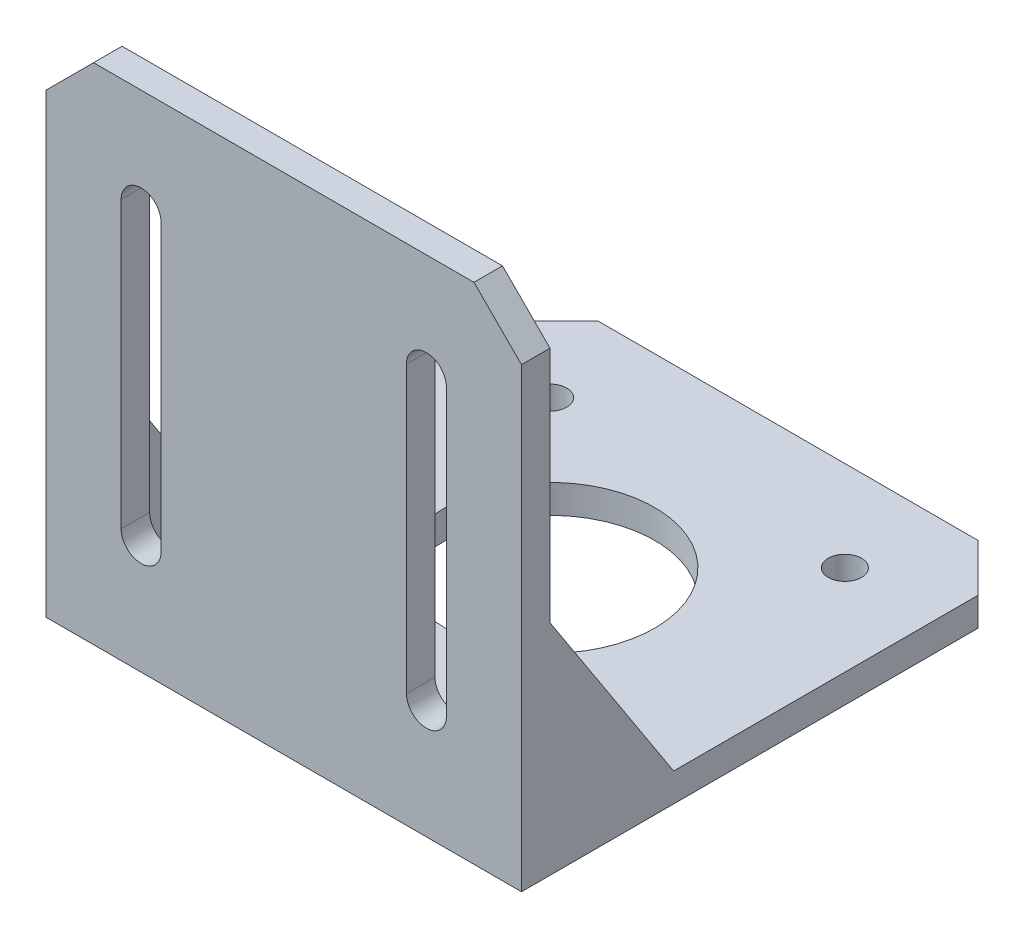
ISO-10303-21;
HEADER;
FILE_DESCRIPTION(('STEP AP214'),'2;1');
FILE_NAME('part.step','',(''),(''),'','','');
FILE_SCHEMA(('AUTOMOTIVE_DESIGN { 1 0 10303 214 1 1 1 1 }'));
ENDSEC;
DATA;
#1=APPLICATION_CONTEXT('core data for automotive mechanical design processes');
#2=APPLICATION_PROTOCOL_DEFINITION('international standard','automotive_design',2000,#1);
#3=PRODUCT_CONTEXT('',#1,'mechanical');
#4=PRODUCT('Part','Part','',(#3));
#5=PRODUCT_RELATED_PRODUCT_CATEGORY('part','',(#4));
#6=PRODUCT_DEFINITION_FORMATION('','',#4);
#7=PRODUCT_DEFINITION_CONTEXT('part definition',#1,'design');
#8=PRODUCT_DEFINITION('design','',#6,#7);
#9=PRODUCT_DEFINITION_SHAPE('','',#8);
#10=(LENGTH_UNIT() NAMED_UNIT(*) SI_UNIT(.MILLI.,.METRE.));
#11=(NAMED_UNIT(*) PLANE_ANGLE_UNIT() SI_UNIT($,.RADIAN.));
#12=(NAMED_UNIT(*) SI_UNIT($,.STERADIAN.) SOLID_ANGLE_UNIT());
#13=UNCERTAINTY_MEASURE_WITH_UNIT(LENGTH_MEASURE(1.E-05),#10,'distance_accuracy_value','');
#14=(GEOMETRIC_REPRESENTATION_CONTEXT(3) GLOBAL_UNCERTAINTY_ASSIGNED_CONTEXT((#13)) GLOBAL_UNIT_ASSIGNED_CONTEXT((#10,
#11,#12)) REPRESENTATION_CONTEXT('',''));
#15=CARTESIAN_POINT('',(0.,0.,0.));
#16=DIRECTION('',(0.,0.,1.));
#17=DIRECTION('',(1.,0.,0.));
#18=AXIS2_PLACEMENT_3D('',#15,#16,#17);
#19=CARTESIAN_POINT('',(0.,3.,0.));
#20=DIRECTION('',(0.,-1.,0.));
#21=DIRECTION('',(0.,0.,-1.));
#22=AXIS2_PLACEMENT_3D('',#19,#20,#21);
#23=PLANE('',#22);
#24=DIRECTION('',(0.,0.,-1.));
#25=VECTOR('',#24,1.);
#26=CARTESIAN_POINT('',(47.,3.,0.));
#27=LINE('',#26,#25);
#28=CARTESIAN_POINT('',(47.,3.,0.));
#29=VERTEX_POINT('',#28);
#30=CARTESIAN_POINT('',(47.,3.,-13.));
#31=VERTEX_POINT('',#30);
#32=EDGE_CURVE('E199',#29,#31,#27,.T.);
#33=ORIENTED_EDGE('',*,*,#32,.T.);
#34=DIRECTION('',(1.,0.,0.));
#35=VECTOR('',#34,1.);
#36=CARTESIAN_POINT('',(47.,3.,-13.));
#37=LINE('',#36,#35);
#38=CARTESIAN_POINT('',(50.,3.,-13.));
#39=VERTEX_POINT('',#38);
#40=EDGE_CURVE('E743',#31,#39,#37,.T.);
#41=ORIENTED_EDGE('',*,*,#40,.T.);
#42=DIRECTION('',(0.,0.,-1.));
#43=VECTOR('',#42,1.);
#44=CARTESIAN_POINT('',(50.,3.,0.));
#45=LINE('',#44,#43);
#46=CARTESIAN_POINT('',(50.,3.,-45.));
#47=VERTEX_POINT('',#46);
#48=EDGE_CURVE('E92',#39,#47,#45,.T.);
#49=ORIENTED_EDGE('',*,*,#48,.T.);
#50=DIRECTION('',(-0.707106781186547,0.,-0.707106781186547));
#51=VECTOR('',#50,1.);
#52=CARTESIAN_POINT('',(45.,3.,-50.));
#53=LINE('',#52,#51);
#54=CARTESIAN_POINT('',(45.,3.,-50.));
#55=VERTEX_POINT('',#54);
#56=EDGE_CURVE('E224',#47,#55,#53,.T.);
#57=ORIENTED_EDGE('',*,*,#56,.T.);
#58=DIRECTION('',(-1.,0.,0.));
#59=VECTOR('',#58,1.);
#60=CARTESIAN_POINT('',(5.,3.,-50.));
#61=LINE('',#60,#59);
#62=CARTESIAN_POINT('',(5.,3.,-50.));
#63=VERTEX_POINT('',#62);
#64=EDGE_CURVE('E230',#55,#63,#61,.T.);
#65=ORIENTED_EDGE('',*,*,#64,.T.);
#66=DIRECTION('',(-0.707106781186548,0.,0.707106781186547));
#67=VECTOR('',#66,1.);
#68=CARTESIAN_POINT('',(0.,3.,-45.));
#69=LINE('',#68,#67);
#70=CARTESIAN_POINT('',(0.,3.,-45.));
#71=VERTEX_POINT('',#70);
#72=EDGE_CURVE('E65',#63,#71,#69,.T.);
#73=ORIENTED_EDGE('',*,*,#72,.T.);
#74=DIRECTION('',(0.,0.,1.));
#75=VECTOR('',#74,1.);
#76=CARTESIAN_POINT('',(0.,3.,0.));
#77=LINE('',#76,#75);
#78=CARTESIAN_POINT('',(0.,3.,-13.));
#79=VERTEX_POINT('',#78);
#80=EDGE_CURVE('E222',#71,#79,#77,.T.);
#81=ORIENTED_EDGE('',*,*,#80,.T.);
#82=DIRECTION('',(-1.,0.,0.));
#83=VECTOR('',#82,1.);
#84=CARTESIAN_POINT('',(3.,3.,-13.));
#85=LINE('',#84,#83);
#86=CARTESIAN_POINT('',(3.,3.,-13.));
#87=VERTEX_POINT('',#86);
#88=EDGE_CURVE('E654',#87,#79,#85,.T.);
#89=ORIENTED_EDGE('',*,*,#88,.F.);
#90=DIRECTION('',(0.,0.,1.));
#91=VECTOR('',#90,1.);
#92=CARTESIAN_POINT('',(3.,3.,0.));
#93=LINE('',#92,#91);
#94=CARTESIAN_POINT('',(3.,3.,0.));
#95=VERTEX_POINT('',#94);
#96=EDGE_CURVE('E221',#87,#95,#93,.T.);
#97=ORIENTED_EDGE('',*,*,#96,.T.);
#98=DIRECTION('',(1.,0.,0.));
#99=VECTOR('',#98,1.);
#100=CARTESIAN_POINT('',(0.,3.,0.));
#101=LINE('',#100,#99);
#102=EDGE_CURVE('E213',#95,#29,#101,.T.);
#103=ORIENTED_EDGE('',*,*,#102,.T.);
#104=EDGE_LOOP('',(#33,#41,#49,#57,#65,#73,#81,#89,#97,#103));
#105=FACE_BOUND('',#104,.T.);
#106=CARTESIAN_POINT('',(25.,3.,-25.));
#107=DIRECTION('',(0.,1.,0.));
#108=DIRECTION('',(0.,0.,1.));
#109=AXIS2_PLACEMENT_3D('',#106,#107,#108);
#110=CIRCLE('',#109,11.);
#111=CARTESIAN_POINT('',(25.,3.,-14.));
#112=VERTEX_POINT('',#111);
#113=EDGE_CURVE('E237',#112,#112,#110,.T.);
#114=ORIENTED_EDGE('',*,*,#113,.F.);
#115=EDGE_LOOP('',(#114));
#116=FACE_BOUND('',#115,.T.);
#117=CARTESIAN_POINT('',(9.5,3.,-40.5));
#118=DIRECTION('',(0.,1.,0.));
#119=DIRECTION('',(0.,0.,1.));
#120=AXIS2_PLACEMENT_3D('',#117,#118,#119);
#121=CIRCLE('',#120,1.75);
#122=CARTESIAN_POINT('',(9.5,3.,-38.75));
#123=VERTEX_POINT('',#122);
#124=EDGE_CURVE('E610',#123,#123,#121,.T.);
#125=ORIENTED_EDGE('',*,*,#124,.F.);
#126=EDGE_LOOP('',(#125));
#127=FACE_BOUND('',#126,.T.);
#128=CARTESIAN_POINT('',(40.5,3.,-40.5));
#129=DIRECTION('',(0.,1.,0.));
#130=DIRECTION('',(0.,0.,-1.));
#131=AXIS2_PLACEMENT_3D('',#128,#129,#130);
#132=CIRCLE('',#131,1.75);
#133=CARTESIAN_POINT('',(40.5,3.,-42.25));
#134=VERTEX_POINT('',#133);
#135=EDGE_CURVE('E604',#134,#134,#132,.T.);
#136=ORIENTED_EDGE('',*,*,#135,.F.);
#137=EDGE_LOOP('',(#136));
#138=FACE_BOUND('',#137,.T.);
#139=CARTESIAN_POINT('',(40.5,3.,-9.5));
#140=DIRECTION('',(0.,1.,0.));
#141=DIRECTION('',(0.,0.,1.));
#142=AXIS2_PLACEMENT_3D('',#139,#140,#141);
#143=CIRCLE('',#142,1.75);
#144=CARTESIAN_POINT('',(40.5,3.,-7.75000000000001));
#145=VERTEX_POINT('',#144);
#146=EDGE_CURVE('E598',#145,#145,#143,.T.);
#147=ORIENTED_EDGE('',*,*,#146,.F.);
#148=EDGE_LOOP('',(#147));
#149=FACE_BOUND('',#148,.T.);
#150=CARTESIAN_POINT('',(9.5,3.,-9.5));
#151=DIRECTION('',(0.,1.,0.));
#152=DIRECTION('',(0.,0.,-1.));
#153=AXIS2_PLACEMENT_3D('',#150,#151,#152);
#154=CIRCLE('',#153,1.75);
#155=CARTESIAN_POINT('',(9.5,3.,-11.25));
#156=VERTEX_POINT('',#155);
#157=EDGE_CURVE('E592',#156,#156,#154,.T.);
#158=ORIENTED_EDGE('',*,*,#157,.F.);
#159=EDGE_LOOP('',(#158));
#160=FACE_BOUND('',#159,.T.);
#161=ADVANCED_FACE('F41',(#105,#116,#127,#138,#149,#160),#23,.F.);
#162=CARTESIAN_POINT('',(0.,0.,0.));
#163=DIRECTION('',(0.,-1.,0.));
#164=DIRECTION('',(0.,0.,-1.));
#165=AXIS2_PLACEMENT_3D('',#162,#163,#164);
#166=PLANE('',#165);
#167=CARTESIAN_POINT('',(40.5,0.,-9.5));
#168=DIRECTION('',(0.,1.,0.));
#169=DIRECTION('',(0.,0.,1.));
#170=AXIS2_PLACEMENT_3D('',#167,#168,#169);
#171=CIRCLE('',#170,1.75);
#172=CARTESIAN_POINT('',(40.5,0.,-7.75000000000001));
#173=VERTEX_POINT('',#172);
#174=EDGE_CURVE('E595',#173,#173,#171,.T.);
#175=ORIENTED_EDGE('',*,*,#174,.T.);
#176=EDGE_LOOP('',(#175));
#177=FACE_BOUND('',#176,.T.);
#178=CARTESIAN_POINT('',(9.5,0.,-40.5));
#179=DIRECTION('',(0.,1.,0.));
#180=DIRECTION('',(0.,0.,1.));
#181=AXIS2_PLACEMENT_3D('',#178,#179,#180);
#182=CIRCLE('',#181,1.75);
#183=CARTESIAN_POINT('',(9.5,0.,-38.75));
#184=VERTEX_POINT('',#183);
#185=EDGE_CURVE('E607',#184,#184,#182,.T.);
#186=ORIENTED_EDGE('',*,*,#185,.T.);
#187=EDGE_LOOP('',(#186));
#188=FACE_BOUND('',#187,.T.);
#189=DIRECTION('',(0.,0.,1.));
#190=VECTOR('',#189,1.);
#191=CARTESIAN_POINT('',(0.,0.,0.));
#192=LINE('',#191,#190);
#193=CARTESIAN_POINT('',(0.,0.,-45.));
#194=VERTEX_POINT('',#193);
#195=CARTESIAN_POINT('',(0.,0.,3.));
#196=VERTEX_POINT('',#195);
#197=EDGE_CURVE('E234',#194,#196,#192,.T.);
#198=ORIENTED_EDGE('',*,*,#197,.F.);
#199=DIRECTION('',(-0.707106781186548,0.,0.707106781186547));
#200=VECTOR('',#199,1.);
#201=CARTESIAN_POINT('',(0.,0.,-45.));
#202=LINE('',#201,#200);
#203=CARTESIAN_POINT('',(5.,0.,-50.));
#204=VERTEX_POINT('',#203);
#205=EDGE_CURVE('E86',#204,#194,#202,.T.);
#206=ORIENTED_EDGE('',*,*,#205,.F.);
#207=DIRECTION('',(-1.,0.,0.));
#208=VECTOR('',#207,1.);
#209=CARTESIAN_POINT('',(5.,0.,-50.));
#210=LINE('',#209,#208);
#211=CARTESIAN_POINT('',(45.,0.,-50.));
#212=VERTEX_POINT('',#211);
#213=EDGE_CURVE('E241',#212,#204,#210,.T.);
#214=ORIENTED_EDGE('',*,*,#213,.F.);
#215=DIRECTION('',(-0.707106781186547,0.,-0.707106781186547));
#216=VECTOR('',#215,1.);
#217=CARTESIAN_POINT('',(45.,0.,-50.));
#218=LINE('',#217,#216);
#219=CARTESIAN_POINT('',(50.,0.,-45.));
#220=VERTEX_POINT('',#219);
#221=EDGE_CURVE('E239',#220,#212,#218,.T.);
#222=ORIENTED_EDGE('',*,*,#221,.F.);
#223=DIRECTION('',(0.,0.,-1.));
#224=VECTOR('',#223,1.);
#225=CARTESIAN_POINT('',(50.,0.,0.));
#226=LINE('',#225,#224);
#227=CARTESIAN_POINT('',(50.,0.,3.));
#228=VERTEX_POINT('',#227);
#229=EDGE_CURVE('E236',#228,#220,#226,.T.);
#230=ORIENTED_EDGE('',*,*,#229,.F.);
#231=DIRECTION('',(1.,0.,0.));
#232=VECTOR('',#231,1.);
#233=CARTESIAN_POINT('',(0.,0.,3.));
#234=LINE('',#233,#232);
#235=EDGE_CURVE('E262',#196,#228,#234,.T.);
#236=ORIENTED_EDGE('',*,*,#235,.F.);
#237=EDGE_LOOP('',(#198,#206,#214,#222,#230,#236));
#238=FACE_BOUND('',#237,.T.);
#239=CARTESIAN_POINT('',(25.,0.,-25.));
#240=DIRECTION('',(0.,1.,0.));
#241=DIRECTION('',(0.,0.,1.));
#242=AXIS2_PLACEMENT_3D('',#239,#240,#241);
#243=CIRCLE('',#242,11.);
#244=CARTESIAN_POINT('',(25.,0.,-14.));
#245=VERTEX_POINT('',#244);
#246=EDGE_CURVE('E613',#245,#245,#243,.T.);
#247=ORIENTED_EDGE('',*,*,#246,.T.);
#248=EDGE_LOOP('',(#247));
#249=FACE_BOUND('',#248,.T.);
#250=CARTESIAN_POINT('',(40.5,0.,-40.5));
#251=DIRECTION('',(0.,1.,0.));
#252=DIRECTION('',(0.,0.,-1.));
#253=AXIS2_PLACEMENT_3D('',#250,#251,#252);
#254=CIRCLE('',#253,1.75);
#255=CARTESIAN_POINT('',(40.5,0.,-42.25));
#256=VERTEX_POINT('',#255);
#257=EDGE_CURVE('E601',#256,#256,#254,.T.);
#258=ORIENTED_EDGE('',*,*,#257,.T.);
#259=EDGE_LOOP('',(#258));
#260=FACE_BOUND('',#259,.T.);
#261=CARTESIAN_POINT('',(9.5,0.,-9.5));
#262=DIRECTION('',(0.,1.,0.));
#263=DIRECTION('',(0.,0.,-1.));
#264=AXIS2_PLACEMENT_3D('',#261,#262,#263);
#265=CIRCLE('',#264,1.75);
#266=CARTESIAN_POINT('',(9.5,0.,-11.25));
#267=VERTEX_POINT('',#266);
#268=EDGE_CURVE('E591',#267,#267,#265,.T.);
#269=ORIENTED_EDGE('',*,*,#268,.T.);
#270=EDGE_LOOP('',(#269));
#271=FACE_BOUND('',#270,.T.);
#272=ADVANCED_FACE('F258',(#177,#188,#238,#249,#260,#271),#166,.T.);
#273=CARTESIAN_POINT('',(0.,3.,0.));
#274=DIRECTION('',(1.,0.,0.));
#275=DIRECTION('',(0.,0.,-1.));
#276=AXIS2_PLACEMENT_3D('',#273,#274,#275);
#277=PLANE('',#276);
#278=ORIENTED_EDGE('',*,*,#197,.T.);
#279=DIRECTION('',(0.,-1.,0.));
#280=VECTOR('',#279,1.);
#281=CARTESIAN_POINT('',(0.,0.,3.));
#282=LINE('',#281,#280);
#283=CARTESIAN_POINT('',(0.,48.,3.));
#284=VERTEX_POINT('',#283);
#285=EDGE_CURVE('E267',#284,#196,#282,.T.);
#286=ORIENTED_EDGE('',*,*,#285,.F.);
#287=DIRECTION('',(0.,0.,-1.));
#288=VECTOR('',#287,1.);
#289=CARTESIAN_POINT('',(0.,48.,3.));
#290=LINE('',#289,#288);
#291=CARTESIAN_POINT('',(0.,48.,0.));
#292=VERTEX_POINT('',#291);
#293=EDGE_CURVE('E569',#284,#292,#290,.T.);
#294=ORIENTED_EDGE('',*,*,#293,.T.);
#295=DIRECTION('',(0.,-1.,0.));
#296=VECTOR('',#295,1.);
#297=CARTESIAN_POINT('',(0.,0.,0.));
#298=LINE('',#297,#296);
#299=CARTESIAN_POINT('',(0.,23.,0.));
#300=VERTEX_POINT('',#299);
#301=EDGE_CURVE('E570',#292,#300,#298,.T.);
#302=ORIENTED_EDGE('',*,*,#301,.T.);
#303=DIRECTION('',(0.,-0.838443616300637,-0.544988350595414));
#304=VECTOR('',#303,1.);
#305=CARTESIAN_POINT('',(0.,3.,-13.));
#306=LINE('',#305,#304);
#307=EDGE_CURVE('E739',#300,#79,#306,.T.);
#308=ORIENTED_EDGE('',*,*,#307,.T.);
#309=ORIENTED_EDGE('',*,*,#80,.F.);
#310=DIRECTION('',(0.,-1.,0.));
#311=VECTOR('',#310,1.);
#312=CARTESIAN_POINT('',(0.,3.,-45.));
#313=LINE('',#312,#311);
#314=EDGE_CURVE('E233',#71,#194,#313,.T.);
#315=ORIENTED_EDGE('',*,*,#314,.T.);
#316=EDGE_LOOP('',(#278,#286,#294,#302,#308,#309,#315));
#317=FACE_BOUND('',#316,.T.);
#318=ADVANCED_FACE('F43',(#317),#277,.F.);
#319=CARTESIAN_POINT('',(50.,3.,0.));
#320=DIRECTION('',(-1.,0.,0.));
#321=DIRECTION('',(0.,0.,1.));
#322=AXIS2_PLACEMENT_3D('',#319,#320,#321);
#323=PLANE('',#322);
#324=ORIENTED_EDGE('',*,*,#48,.F.);
#325=DIRECTION('',(0.,0.838443616300637,0.544988350595414));
#326=VECTOR('',#325,1.);
#327=CARTESIAN_POINT('',(50.,3.,-13.));
#328=LINE('',#327,#326);
#329=CARTESIAN_POINT('',(50.,23.,0.));
#330=VERTEX_POINT('',#329);
#331=EDGE_CURVE('E56',#39,#330,#328,.T.);
#332=ORIENTED_EDGE('',*,*,#331,.T.);
#333=DIRECTION('',(0.,1.,0.));
#334=VECTOR('',#333,1.);
#335=CARTESIAN_POINT('',(50.,0.,0.));
#336=LINE('',#335,#334);
#337=CARTESIAN_POINT('',(50.,48.,0.));
#338=VERTEX_POINT('',#337);
#339=EDGE_CURVE('E573',#330,#338,#336,.T.);
#340=ORIENTED_EDGE('',*,*,#339,.T.);
#341=DIRECTION('',(0.,0.,-1.));
#342=VECTOR('',#341,1.);
#343=CARTESIAN_POINT('',(50.,48.,3.));
#344=LINE('',#343,#342);
#345=CARTESIAN_POINT('',(50.,48.,3.));
#346=VERTEX_POINT('',#345);
#347=EDGE_CURVE('E588',#346,#338,#344,.T.);
#348=ORIENTED_EDGE('',*,*,#347,.F.);
#349=DIRECTION('',(0.,1.,0.));
#350=VECTOR('',#349,1.);
#351=CARTESIAN_POINT('',(50.,0.,3.));
#352=LINE('',#351,#350);
#353=EDGE_CURVE('E554',#228,#346,#352,.T.);
#354=ORIENTED_EDGE('',*,*,#353,.F.);
#355=ORIENTED_EDGE('',*,*,#229,.T.);
#356=DIRECTION('',(0.,-1.,0.));
#357=VECTOR('',#356,1.);
#358=CARTESIAN_POINT('',(50.,3.,-45.));
#359=LINE('',#358,#357);
#360=EDGE_CURVE('E11',#47,#220,#359,.T.);
#361=ORIENTED_EDGE('',*,*,#360,.F.);
#362=EDGE_LOOP('',(#324,#332,#340,#348,#354,#355,#361));
#363=FACE_BOUND('',#362,.T.);
#364=ADVANCED_FACE('F388',(#363),#323,.F.);
#365=CARTESIAN_POINT('',(45.,3.,-50.));
#366=DIRECTION('',(-0.707106781186548,0.,0.707106781186548));
#367=DIRECTION('',(0.707106781186548,0.,0.707106781186548));
#368=AXIS2_PLACEMENT_3D('',#365,#366,#367);
#369=PLANE('',#368);
#370=ORIENTED_EDGE('',*,*,#221,.T.);
#371=DIRECTION('',(0.,-1.,0.));
#372=VECTOR('',#371,1.);
#373=CARTESIAN_POINT('',(45.,3.,-50.));
#374=LINE('',#373,#372);
#375=EDGE_CURVE('E49',#55,#212,#374,.T.);
#376=ORIENTED_EDGE('',*,*,#375,.F.);
#377=ORIENTED_EDGE('',*,*,#56,.F.);
#378=ORIENTED_EDGE('',*,*,#360,.T.);
#379=EDGE_LOOP('',(#370,#376,#377,#378));
#380=FACE_BOUND('',#379,.T.);
#381=ADVANCED_FACE('F281',(#380),#369,.F.);
#382=CARTESIAN_POINT('',(5.,3.,-50.));
#383=DIRECTION('',(0.,0.,1.));
#384=DIRECTION('',(1.,0.,0.));
#385=AXIS2_PLACEMENT_3D('',#382,#383,#384);
#386=PLANE('',#385);
#387=ORIENTED_EDGE('',*,*,#213,.T.);
#388=DIRECTION('',(0.,-1.,0.));
#389=VECTOR('',#388,1.);
#390=CARTESIAN_POINT('',(5.,3.,-50.));
#391=LINE('',#390,#389);
#392=EDGE_CURVE('E245',#63,#204,#391,.T.);
#393=ORIENTED_EDGE('',*,*,#392,.F.);
#394=ORIENTED_EDGE('',*,*,#64,.F.);
#395=ORIENTED_EDGE('',*,*,#375,.T.);
#396=EDGE_LOOP('',(#387,#393,#394,#395));
#397=FACE_BOUND('',#396,.T.);
#398=ADVANCED_FACE('F251',(#397),#386,.F.);
#399=CARTESIAN_POINT('',(0.,3.,-45.));
#400=DIRECTION('',(0.707106781186547,0.,0.707106781186548));
#401=DIRECTION('',(0.707106781186548,0.,-0.707106781186547));
#402=AXIS2_PLACEMENT_3D('',#399,#400,#401);
#403=PLANE('',#402);
#404=ORIENTED_EDGE('',*,*,#205,.T.);
#405=ORIENTED_EDGE('',*,*,#314,.F.);
#406=ORIENTED_EDGE('',*,*,#72,.F.);
#407=ORIENTED_EDGE('',*,*,#392,.T.);
#408=EDGE_LOOP('',(#404,#405,#406,#407));
#409=FACE_BOUND('',#408,.T.);
#410=ADVANCED_FACE('F270',(#409),#403,.F.);
#411=CARTESIAN_POINT('',(25.,3.,-25.));
#412=DIRECTION('',(0.,-1.,0.));
#413=DIRECTION('',(0.,0.,-1.));
#414=AXIS2_PLACEMENT_3D('',#411,#412,#413);
#415=CYLINDRICAL_SURFACE('',#414,11.);
#416=ORIENTED_EDGE('',*,*,#113,.T.);
#417=EDGE_LOOP('',(#416));
#418=FACE_BOUND('',#417,.T.);
#419=ORIENTED_EDGE('',*,*,#246,.F.);
#420=EDGE_LOOP('',(#419));
#421=FACE_BOUND('',#420,.T.);
#422=ADVANCED_FACE('F272',(#418,#421),#415,.F.);
#423=CARTESIAN_POINT('',(9.5,3.,-40.5));
#424=DIRECTION('',(0.,-1.,0.));
#425=DIRECTION('',(0.,0.,-1.));
#426=AXIS2_PLACEMENT_3D('',#423,#424,#425);
#427=CYLINDRICAL_SURFACE('',#426,1.75);
#428=ORIENTED_EDGE('',*,*,#124,.T.);
#429=EDGE_LOOP('',(#428));
#430=FACE_BOUND('',#429,.T.);
#431=ORIENTED_EDGE('',*,*,#185,.F.);
#432=EDGE_LOOP('',(#431));
#433=FACE_BOUND('',#432,.T.);
#434=ADVANCED_FACE('F278',(#430,#433),#427,.F.);
#435=CARTESIAN_POINT('',(40.5,3.,-40.5));
#436=DIRECTION('',(0.,-1.,0.));
#437=DIRECTION('',(0.,0.,-1.));
#438=AXIS2_PLACEMENT_3D('',#435,#436,#437);
#439=CYLINDRICAL_SURFACE('',#438,1.75);
#440=ORIENTED_EDGE('',*,*,#135,.T.);
#441=EDGE_LOOP('',(#440));
#442=FACE_BOUND('',#441,.T.);
#443=ORIENTED_EDGE('',*,*,#257,.F.);
#444=EDGE_LOOP('',(#443));
#445=FACE_BOUND('',#444,.T.);
#446=ADVANCED_FACE('F295',(#442,#445),#439,.F.);
#447=CARTESIAN_POINT('',(40.5,3.,-9.5));
#448=DIRECTION('',(0.,-1.,0.));
#449=DIRECTION('',(0.,0.,-1.));
#450=AXIS2_PLACEMENT_3D('',#447,#448,#449);
#451=CYLINDRICAL_SURFACE('',#450,1.75);
#452=ORIENTED_EDGE('',*,*,#146,.T.);
#453=EDGE_LOOP('',(#452));
#454=FACE_BOUND('',#453,.T.);
#455=ORIENTED_EDGE('',*,*,#174,.F.);
#456=EDGE_LOOP('',(#455));
#457=FACE_BOUND('',#456,.T.);
#458=ADVANCED_FACE('F299',(#454,#457),#451,.F.);
#459=CARTESIAN_POINT('',(9.5,3.,-9.5));
#460=DIRECTION('',(0.,-1.,0.));
#461=DIRECTION('',(0.,0.,-1.));
#462=AXIS2_PLACEMENT_3D('',#459,#460,#461);
#463=CYLINDRICAL_SURFACE('',#462,1.75);
#464=ORIENTED_EDGE('',*,*,#157,.T.);
#465=EDGE_LOOP('',(#464));
#466=FACE_BOUND('',#465,.T.);
#467=ORIENTED_EDGE('',*,*,#268,.F.);
#468=EDGE_LOOP('',(#467));
#469=FACE_BOUND('',#468,.T.);
#470=ADVANCED_FACE('F303',(#466,#469),#463,.F.);
#471=CARTESIAN_POINT('',(0.,0.,0.));
#472=DIRECTION('',(0.,0.,-1.));
#473=DIRECTION('',(-1.,0.,0.));
#474=AXIS2_PLACEMENT_3D('',#471,#472,#473);
#475=PLANE('',#474);
#476=DIRECTION('',(1.,0.,0.));
#477=VECTOR('',#476,1.);
#478=CARTESIAN_POINT('',(47.,23.,0.));
#479=LINE('',#478,#477);
#480=CARTESIAN_POINT('',(47.,23.,0.));
#481=VERTEX_POINT('',#480);
#482=EDGE_CURVE('E215',#481,#330,#479,.T.);
#483=ORIENTED_EDGE('',*,*,#482,.F.);
#484=DIRECTION('',(0.,-1.,0.));
#485=VECTOR('',#484,1.);
#486=CARTESIAN_POINT('',(47.,23.,0.));
#487=LINE('',#486,#485);
#488=EDGE_CURVE('E202',#481,#29,#487,.T.);
#489=ORIENTED_EDGE('',*,*,#488,.T.);
#490=ORIENTED_EDGE('',*,*,#102,.F.);
#491=DIRECTION('',(0.,1.,0.));
#492=VECTOR('',#491,1.);
#493=CARTESIAN_POINT('',(3.,23.,0.));
#494=LINE('',#493,#492);
#495=CARTESIAN_POINT('',(3.,23.,0.));
#496=VERTEX_POINT('',#495);
#497=EDGE_CURVE('E652',#95,#496,#494,.T.);
#498=ORIENTED_EDGE('',*,*,#497,.T.);
#499=DIRECTION('',(-1.,0.,0.));
#500=VECTOR('',#499,1.);
#501=CARTESIAN_POINT('',(3.,23.,0.));
#502=LINE('',#501,#500);
#503=EDGE_CURVE('E651',#496,#300,#502,.T.);
#504=ORIENTED_EDGE('',*,*,#503,.T.);
#505=ORIENTED_EDGE('',*,*,#301,.F.);
#506=DIRECTION('',(-0.707106781186548,-0.707106781186547,0.));
#507=VECTOR('',#506,1.);
#508=CARTESIAN_POINT('',(0.,48.,0.));
#509=LINE('',#508,#507);
#510=CARTESIAN_POINT('',(5.00000000000001,53.,0.));
#511=VERTEX_POINT('',#510);
#512=EDGE_CURVE('E560',#511,#292,#509,.T.);
#513=ORIENTED_EDGE('',*,*,#512,.F.);
#514=DIRECTION('',(-1.,0.,0.));
#515=VECTOR('',#514,1.);
#516=CARTESIAN_POINT('',(5.00000000000001,53.,0.));
#517=LINE('',#516,#515);
#518=CARTESIAN_POINT('',(45.,53.,0.));
#519=VERTEX_POINT('',#518);
#520=EDGE_CURVE('E578',#519,#511,#517,.T.);
#521=ORIENTED_EDGE('',*,*,#520,.F.);
#522=DIRECTION('',(-0.707106781186547,0.707106781186547,0.));
#523=VECTOR('',#522,1.);
#524=CARTESIAN_POINT('',(45.,53.,0.));
#525=LINE('',#524,#523);
#526=EDGE_CURVE('E576',#338,#519,#525,.T.);
#527=ORIENTED_EDGE('',*,*,#526,.F.);
#528=ORIENTED_EDGE('',*,*,#339,.F.);
#529=EDGE_LOOP('',(#483,#489,#490,#498,#504,#505,#513,#521,#527,#528));
#530=FACE_BOUND('',#529,.T.);
#531=DIRECTION('',(0.,1.,0.));
#532=VECTOR('',#531,1.);
#533=CARTESIAN_POINT('',(42.1,42.,0.));
#534=LINE('',#533,#532);
#535=CARTESIAN_POINT('',(42.1,12.,0.));
#536=VERTEX_POINT('',#535);
#537=CARTESIAN_POINT('',(42.1,42.,0.));
#538=VERTEX_POINT('',#537);
#539=EDGE_CURVE('E665',#536,#538,#534,.T.);
#540=ORIENTED_EDGE('',*,*,#539,.T.);
#541=CARTESIAN_POINT('',(40.,42.,0.));
#542=DIRECTION('',(0.,0.,1.));
#543=DIRECTION('',(1.,0.,0.));
#544=AXIS2_PLACEMENT_3D('',#541,#542,#543);
#545=CIRCLE('',#544,2.1);
#546=CARTESIAN_POINT('',(37.9,42.,0.));
#547=VERTEX_POINT('',#546);
#548=EDGE_CURVE('E656',#538,#547,#545,.T.);
#549=ORIENTED_EDGE('',*,*,#548,.T.);
#550=DIRECTION('',(0.,-1.,0.));
#551=VECTOR('',#550,1.);
#552=CARTESIAN_POINT('',(37.9,42.,0.));
#553=LINE('',#552,#551);
#554=CARTESIAN_POINT('',(37.9,12.,0.));
#555=VERTEX_POINT('',#554);
#556=EDGE_CURVE('E675',#547,#555,#553,.T.);
#557=ORIENTED_EDGE('',*,*,#556,.T.);
#558=CARTESIAN_POINT('',(40.,12.,0.));
#559=DIRECTION('',(0.,0.,1.));
#560=DIRECTION('',(-1.,0.,0.));
#561=AXIS2_PLACEMENT_3D('',#558,#559,#560);
#562=CIRCLE('',#561,2.1);
#563=EDGE_CURVE('E678',#555,#536,#562,.T.);
#564=ORIENTED_EDGE('',*,*,#563,.T.);
#565=EDGE_LOOP('',(#540,#549,#557,#564));
#566=FACE_BOUND('',#565,.T.);
#567=DIRECTION('',(0.,1.,0.));
#568=VECTOR('',#567,1.);
#569=CARTESIAN_POINT('',(12.1,42.,0.));
#570=LINE('',#569,#568);
#571=CARTESIAN_POINT('',(12.1,12.,0.));
#572=VERTEX_POINT('',#571);
#573=CARTESIAN_POINT('',(12.1,42.,0.));
#574=VERTEX_POINT('',#573);
#575=EDGE_CURVE('E696',#572,#574,#570,.T.);
#576=ORIENTED_EDGE('',*,*,#575,.T.);
#577=CARTESIAN_POINT('',(10.,42.,0.));
#578=DIRECTION('',(0.,0.,1.));
#579=DIRECTION('',(-1.,0.,0.));
#580=AXIS2_PLACEMENT_3D('',#577,#578,#579);
#581=CIRCLE('',#580,2.1);
#582=CARTESIAN_POINT('',(7.9,42.,0.));
#583=VERTEX_POINT('',#582);
#584=EDGE_CURVE('E692',#574,#583,#581,.T.);
#585=ORIENTED_EDGE('',*,*,#584,.T.);
#586=DIRECTION('',(0.,-1.,0.));
#587=VECTOR('',#586,1.);
#588=CARTESIAN_POINT('',(7.9,42.,0.));
#589=LINE('',#588,#587);
#590=CARTESIAN_POINT('',(7.9,12.,0.));
#591=VERTEX_POINT('',#590);
#592=EDGE_CURVE('E706',#583,#591,#589,.T.);
#593=ORIENTED_EDGE('',*,*,#592,.T.);
#594=CARTESIAN_POINT('',(10.,12.,0.));
#595=DIRECTION('',(0.,0.,1.));
#596=DIRECTION('',(1.,0.,0.));
#597=AXIS2_PLACEMENT_3D('',#594,#595,#596);
#598=CIRCLE('',#597,2.1);
#599=EDGE_CURVE('E709',#591,#572,#598,.T.);
#600=ORIENTED_EDGE('',*,*,#599,.T.);
#601=EDGE_LOOP('',(#576,#585,#593,#600));
#602=FACE_BOUND('',#601,.T.);
#603=ADVANCED_FACE('F210',(#530,#566,#602),#475,.T.);
#604=CARTESIAN_POINT('',(0.,0.,3.));
#605=DIRECTION('',(0.,0.,-1.));
#606=DIRECTION('',(-1.,0.,0.));
#607=AXIS2_PLACEMENT_3D('',#604,#605,#606);
#608=PLANE('',#607);
#609=CARTESIAN_POINT('',(10.,42.,3.));
#610=DIRECTION('',(0.,0.,1.));
#611=DIRECTION('',(-1.,0.,0.));
#612=AXIS2_PLACEMENT_3D('',#609,#610,#611);
#613=CIRCLE('',#612,2.1);
#614=CARTESIAN_POINT('',(12.1,42.,3.));
#615=VERTEX_POINT('',#614);
#616=CARTESIAN_POINT('',(7.9,42.,3.));
#617=VERTEX_POINT('',#616);
#618=EDGE_CURVE('E693',#615,#617,#613,.T.);
#619=ORIENTED_EDGE('',*,*,#618,.F.);
#620=DIRECTION('',(0.,1.,0.));
#621=VECTOR('',#620,1.);
#622=CARTESIAN_POINT('',(12.1,42.,3.));
#623=LINE('',#622,#621);
#624=CARTESIAN_POINT('',(12.1,12.,3.));
#625=VERTEX_POINT('',#624);
#626=EDGE_CURVE('E701',#625,#615,#623,.T.);
#627=ORIENTED_EDGE('',*,*,#626,.F.);
#628=CARTESIAN_POINT('',(10.,12.,3.));
#629=DIRECTION('',(0.,0.,1.));
#630=DIRECTION('',(1.,0.,0.));
#631=AXIS2_PLACEMENT_3D('',#628,#629,#630);
#632=CIRCLE('',#631,2.1);
#633=CARTESIAN_POINT('',(7.9,12.,3.));
#634=VERTEX_POINT('',#633);
#635=EDGE_CURVE('E698',#634,#625,#632,.T.);
#636=ORIENTED_EDGE('',*,*,#635,.F.);
#637=DIRECTION('',(0.,-1.,0.));
#638=VECTOR('',#637,1.);
#639=CARTESIAN_POINT('',(7.9,42.,3.));
#640=LINE('',#639,#638);
#641=EDGE_CURVE('E695',#617,#634,#640,.T.);
#642=ORIENTED_EDGE('',*,*,#641,.F.);
#643=EDGE_LOOP('',(#619,#627,#636,#642));
#644=FACE_BOUND('',#643,.T.);
#645=ORIENTED_EDGE('',*,*,#285,.T.);
#646=ORIENTED_EDGE('',*,*,#235,.T.);
#647=ORIENTED_EDGE('',*,*,#353,.T.);
#648=DIRECTION('',(-0.707106781186547,0.707106781186547,0.));
#649=VECTOR('',#648,1.);
#650=CARTESIAN_POINT('',(45.,53.,3.));
#651=LINE('',#650,#649);
#652=CARTESIAN_POINT('',(45.,53.,3.));
#653=VERTEX_POINT('',#652);
#654=EDGE_CURVE('E558',#346,#653,#651,.T.);
#655=ORIENTED_EDGE('',*,*,#654,.T.);
#656=DIRECTION('',(-1.,0.,0.));
#657=VECTOR('',#656,1.);
#658=CARTESIAN_POINT('',(5.00000000000001,53.,3.));
#659=LINE('',#658,#657);
#660=CARTESIAN_POINT('',(5.00000000000001,53.,3.));
#661=VERTEX_POINT('',#660);
#662=EDGE_CURVE('E565',#653,#661,#659,.T.);
#663=ORIENTED_EDGE('',*,*,#662,.T.);
#664=DIRECTION('',(-0.707106781186548,-0.707106781186547,0.));
#665=VECTOR('',#664,1.);
#666=CARTESIAN_POINT('',(0.,48.,3.));
#667=LINE('',#666,#665);
#668=EDGE_CURVE('E567',#661,#284,#667,.T.);
#669=ORIENTED_EDGE('',*,*,#668,.T.);
#670=EDGE_LOOP('',(#645,#646,#647,#655,#663,#669));
#671=FACE_BOUND('',#670,.T.);
#672=CARTESIAN_POINT('',(40.,42.,3.));
#673=DIRECTION('',(0.,0.,1.));
#674=DIRECTION('',(1.,0.,0.));
#675=AXIS2_PLACEMENT_3D('',#672,#673,#674);
#676=CIRCLE('',#675,2.1);
#677=CARTESIAN_POINT('',(42.1,42.,3.));
#678=VERTEX_POINT('',#677);
#679=CARTESIAN_POINT('',(37.9,42.,3.));
#680=VERTEX_POINT('',#679);
#681=EDGE_CURVE('E662',#678,#680,#676,.T.);
#682=ORIENTED_EDGE('',*,*,#681,.F.);
#683=DIRECTION('',(0.,1.,0.));
#684=VECTOR('',#683,1.);
#685=CARTESIAN_POINT('',(42.1,42.,3.));
#686=LINE('',#685,#684);
#687=CARTESIAN_POINT('',(42.1,12.,3.));
#688=VERTEX_POINT('',#687);
#689=EDGE_CURVE('E670',#688,#678,#686,.T.);
#690=ORIENTED_EDGE('',*,*,#689,.F.);
#691=CARTESIAN_POINT('',(40.,12.,3.));
#692=DIRECTION('',(0.,0.,1.));
#693=DIRECTION('',(-1.,0.,0.));
#694=AXIS2_PLACEMENT_3D('',#691,#692,#693);
#695=CIRCLE('',#694,2.1);
#696=CARTESIAN_POINT('',(37.9,12.,3.));
#697=VERTEX_POINT('',#696);
#698=EDGE_CURVE('E667',#697,#688,#695,.T.);
#699=ORIENTED_EDGE('',*,*,#698,.F.);
#700=DIRECTION('',(0.,-1.,0.));
#701=VECTOR('',#700,1.);
#702=CARTESIAN_POINT('',(37.9,42.,3.));
#703=LINE('',#702,#701);
#704=EDGE_CURVE('E664',#680,#697,#703,.T.);
#705=ORIENTED_EDGE('',*,*,#704,.F.);
#706=EDGE_LOOP('',(#682,#690,#699,#705));
#707=FACE_BOUND('',#706,.T.);
#708=ADVANCED_FACE('F312',(#644,#671,#707),#608,.F.);
#709=CARTESIAN_POINT('',(45.,53.,3.));
#710=DIRECTION('',(-0.707106781186548,-0.707106781186548,0.));
#711=DIRECTION('',(0.707106781186548,-0.707106781186548,0.));
#712=AXIS2_PLACEMENT_3D('',#709,#710,#711);
#713=PLANE('',#712);
#714=ORIENTED_EDGE('',*,*,#526,.T.);
#715=DIRECTION('',(0.,0.,-1.));
#716=VECTOR('',#715,1.);
#717=CARTESIAN_POINT('',(45.,53.,3.));
#718=LINE('',#717,#716);
#719=EDGE_CURVE('E585',#653,#519,#718,.T.);
#720=ORIENTED_EDGE('',*,*,#719,.F.);
#721=ORIENTED_EDGE('',*,*,#654,.F.);
#722=ORIENTED_EDGE('',*,*,#347,.T.);
#723=EDGE_LOOP('',(#714,#720,#721,#722));
#724=FACE_BOUND('',#723,.T.);
#725=ADVANCED_FACE('F308',(#724),#713,.F.);
#726=CARTESIAN_POINT('',(5.00000000000001,53.,3.));
#727=DIRECTION('',(0.,-1.,0.));
#728=DIRECTION('',(0.,0.,-1.));
#729=AXIS2_PLACEMENT_3D('',#726,#727,#728);
#730=PLANE('',#729);
#731=ORIENTED_EDGE('',*,*,#520,.T.);
#732=DIRECTION('',(0.,0.,-1.));
#733=VECTOR('',#732,1.);
#734=CARTESIAN_POINT('',(5.00000000000001,53.,3.));
#735=LINE('',#734,#733);
#736=EDGE_CURVE('E582',#661,#511,#735,.T.);
#737=ORIENTED_EDGE('',*,*,#736,.F.);
#738=ORIENTED_EDGE('',*,*,#662,.F.);
#739=ORIENTED_EDGE('',*,*,#719,.T.);
#740=EDGE_LOOP('',(#731,#737,#738,#739));
#741=FACE_BOUND('',#740,.T.);
#742=ADVANCED_FACE('F311',(#741),#730,.F.);
#743=CARTESIAN_POINT('',(0.,48.,3.));
#744=DIRECTION('',(0.707106781186547,-0.707106781186548,0.));
#745=DIRECTION('',(0.707106781186548,0.707106781186547,0.));
#746=AXIS2_PLACEMENT_3D('',#743,#744,#745);
#747=PLANE('',#746);
#748=ORIENTED_EDGE('',*,*,#512,.T.);
#749=ORIENTED_EDGE('',*,*,#293,.F.);
#750=ORIENTED_EDGE('',*,*,#668,.F.);
#751=ORIENTED_EDGE('',*,*,#736,.T.);
#752=EDGE_LOOP('',(#748,#749,#750,#751));
#753=FACE_BOUND('',#752,.T.);
#754=ADVANCED_FACE('F316',(#753),#747,.F.);
#755=CARTESIAN_POINT('',(10.,42.,3.));
#756=DIRECTION('',(0.,0.,-1.));
#757=DIRECTION('',(-1.,0.,0.));
#758=AXIS2_PLACEMENT_3D('',#755,#756,#757);
#759=CYLINDRICAL_SURFACE('',#758,2.1);
#760=ORIENTED_EDGE('',*,*,#584,.F.);
#761=DIRECTION('',(0.,0.,-1.));
#762=VECTOR('',#761,1.);
#763=CARTESIAN_POINT('',(12.1,42.,3.));
#764=LINE('',#763,#762);
#765=EDGE_CURVE('E703',#615,#574,#764,.T.);
#766=ORIENTED_EDGE('',*,*,#765,.F.);
#767=ORIENTED_EDGE('',*,*,#618,.T.);
#768=DIRECTION('',(0.,0.,-1.));
#769=VECTOR('',#768,1.);
#770=CARTESIAN_POINT('',(7.9,42.,3.));
#771=LINE('',#770,#769);
#772=EDGE_CURVE('E574',#617,#583,#771,.T.);
#773=ORIENTED_EDGE('',*,*,#772,.T.);
#774=EDGE_LOOP('',(#760,#766,#767,#773));
#775=FACE_BOUND('',#774,.T.);
#776=ADVANCED_FACE('F320',(#775),#759,.F.);
#777=CARTESIAN_POINT('',(7.9,42.,3.));
#778=DIRECTION('',(1.,0.,0.));
#779=DIRECTION('',(0.,1.,0.));
#780=AXIS2_PLACEMENT_3D('',#777,#778,#779);
#781=PLANE('',#780);
#782=ORIENTED_EDGE('',*,*,#592,.F.);
#783=ORIENTED_EDGE('',*,*,#772,.F.);
#784=ORIENTED_EDGE('',*,*,#641,.T.);
#785=DIRECTION('',(0.,0.,-1.));
#786=VECTOR('',#785,1.);
#787=CARTESIAN_POINT('',(7.9,12.,3.));
#788=LINE('',#787,#786);
#789=EDGE_CURVE('E718',#634,#591,#788,.T.);
#790=ORIENTED_EDGE('',*,*,#789,.T.);
#791=EDGE_LOOP('',(#782,#783,#784,#790));
#792=FACE_BOUND('',#791,.T.);
#793=ADVANCED_FACE('F329',(#792),#781,.T.);
#794=CARTESIAN_POINT('',(10.,12.,3.));
#795=DIRECTION('',(0.,0.,-1.));
#796=DIRECTION('',(-1.,0.,0.));
#797=AXIS2_PLACEMENT_3D('',#794,#795,#796);
#798=CYLINDRICAL_SURFACE('',#797,2.1);
#799=ORIENTED_EDGE('',*,*,#599,.F.);
#800=ORIENTED_EDGE('',*,*,#789,.F.);
#801=ORIENTED_EDGE('',*,*,#635,.T.);
#802=DIRECTION('',(0.,0.,-1.));
#803=VECTOR('',#802,1.);
#804=CARTESIAN_POINT('',(12.1,12.,3.));
#805=LINE('',#804,#803);
#806=EDGE_CURVE('E716',#625,#572,#805,.T.);
#807=ORIENTED_EDGE('',*,*,#806,.T.);
#808=EDGE_LOOP('',(#799,#800,#801,#807));
#809=FACE_BOUND('',#808,.T.);
#810=ADVANCED_FACE('F333',(#809),#798,.F.);
#811=CARTESIAN_POINT('',(12.1,42.,3.));
#812=DIRECTION('',(-1.,0.,0.));
#813=DIRECTION('',(0.,-1.,0.));
#814=AXIS2_PLACEMENT_3D('',#811,#812,#813);
#815=PLANE('',#814);
#816=ORIENTED_EDGE('',*,*,#575,.F.);
#817=ORIENTED_EDGE('',*,*,#806,.F.);
#818=ORIENTED_EDGE('',*,*,#626,.T.);
#819=ORIENTED_EDGE('',*,*,#765,.T.);
#820=EDGE_LOOP('',(#816,#817,#818,#819));
#821=FACE_BOUND('',#820,.T.);
#822=ADVANCED_FACE('F337',(#821),#815,.T.);
#823=CARTESIAN_POINT('',(40.,42.,3.));
#824=DIRECTION('',(0.,0.,-1.));
#825=DIRECTION('',(-1.,0.,0.));
#826=AXIS2_PLACEMENT_3D('',#823,#824,#825);
#827=CYLINDRICAL_SURFACE('',#826,2.1);
#828=ORIENTED_EDGE('',*,*,#548,.F.);
#829=DIRECTION('',(0.,0.,-1.));
#830=VECTOR('',#829,1.);
#831=CARTESIAN_POINT('',(42.1,42.,3.));
#832=LINE('',#831,#830);
#833=EDGE_CURVE('E672',#678,#538,#832,.T.);
#834=ORIENTED_EDGE('',*,*,#833,.F.);
#835=ORIENTED_EDGE('',*,*,#681,.T.);
#836=DIRECTION('',(0.,0.,-1.));
#837=VECTOR('',#836,1.);
#838=CARTESIAN_POINT('',(37.9,42.,3.));
#839=LINE('',#838,#837);
#840=EDGE_CURVE('E689',#680,#547,#839,.T.);
#841=ORIENTED_EDGE('',*,*,#840,.T.);
#842=EDGE_LOOP('',(#828,#834,#835,#841));
#843=FACE_BOUND('',#842,.T.);
#844=ADVANCED_FACE('F341',(#843),#827,.F.);
#845=CARTESIAN_POINT('',(37.9,42.,3.));
#846=DIRECTION('',(1.,0.,0.));
#847=DIRECTION('',(0.,0.,-1.));
#848=AXIS2_PLACEMENT_3D('',#845,#846,#847);
#849=PLANE('',#848);
#850=ORIENTED_EDGE('',*,*,#556,.F.);
#851=ORIENTED_EDGE('',*,*,#840,.F.);
#852=ORIENTED_EDGE('',*,*,#704,.T.);
#853=DIRECTION('',(0.,0.,-1.));
#854=VECTOR('',#853,1.);
#855=CARTESIAN_POINT('',(37.9,12.,3.));
#856=LINE('',#855,#854);
#857=EDGE_CURVE('E687',#697,#555,#856,.T.);
#858=ORIENTED_EDGE('',*,*,#857,.T.);
#859=EDGE_LOOP('',(#850,#851,#852,#858));
#860=FACE_BOUND('',#859,.T.);
#861=ADVANCED_FACE('F345',(#860),#849,.T.);
#862=CARTESIAN_POINT('',(40.,12.,3.));
#863=DIRECTION('',(0.,0.,-1.));
#864=DIRECTION('',(-1.,0.,0.));
#865=AXIS2_PLACEMENT_3D('',#862,#863,#864);
#866=CYLINDRICAL_SURFACE('',#865,2.1);
#867=ORIENTED_EDGE('',*,*,#563,.F.);
#868=ORIENTED_EDGE('',*,*,#857,.F.);
#869=ORIENTED_EDGE('',*,*,#698,.T.);
#870=DIRECTION('',(0.,0.,-1.));
#871=VECTOR('',#870,1.);
#872=CARTESIAN_POINT('',(42.1,12.,3.));
#873=LINE('',#872,#871);
#874=EDGE_CURVE('E685',#688,#536,#873,.T.);
#875=ORIENTED_EDGE('',*,*,#874,.T.);
#876=EDGE_LOOP('',(#867,#868,#869,#875));
#877=FACE_BOUND('',#876,.T.);
#878=ADVANCED_FACE('F349',(#877),#866,.F.);
#879=CARTESIAN_POINT('',(42.1,42.,3.));
#880=DIRECTION('',(-1.,0.,0.));
#881=DIRECTION('',(0.,0.,1.));
#882=AXIS2_PLACEMENT_3D('',#879,#880,#881);
#883=PLANE('',#882);
#884=ORIENTED_EDGE('',*,*,#539,.F.);
#885=ORIENTED_EDGE('',*,*,#874,.F.);
#886=ORIENTED_EDGE('',*,*,#689,.T.);
#887=ORIENTED_EDGE('',*,*,#833,.T.);
#888=EDGE_LOOP('',(#884,#885,#886,#887));
#889=FACE_BOUND('',#888,.T.);
#890=ADVANCED_FACE('F353',(#889),#883,.T.);
#891=CARTESIAN_POINT('',(3.,3.,-13.));
#892=DIRECTION('',(0.,0.544988350595414,-0.838443616300637));
#893=DIRECTION('',(0.,0.838443616300637,0.544988350595414));
#894=AXIS2_PLACEMENT_3D('',#891,#892,#893);
#895=PLANE('',#894);
#896=ORIENTED_EDGE('',*,*,#307,.F.);
#897=ORIENTED_EDGE('',*,*,#503,.F.);
#898=DIRECTION('',(0.,-0.838443616300637,-0.544988350595414));
#899=VECTOR('',#898,1.);
#900=CARTESIAN_POINT('',(3.,3.,-13.));
#901=LINE('',#900,#899);
#902=EDGE_CURVE('E658',#496,#87,#901,.T.);
#903=ORIENTED_EDGE('',*,*,#902,.T.);
#904=ORIENTED_EDGE('',*,*,#88,.T.);
#905=EDGE_LOOP('',(#896,#897,#903,#904));
#906=FACE_BOUND('',#905,.T.);
#907=ADVANCED_FACE('F357',(#906),#895,.T.);
#908=CARTESIAN_POINT('',(3.,0.,0.));
#909=DIRECTION('',(1.,0.,0.));
#910=DIRECTION('',(0.,0.,-1.));
#911=AXIS2_PLACEMENT_3D('',#908,#909,#910);
#912=PLANE('',#911);
#913=ORIENTED_EDGE('',*,*,#497,.F.);
#914=ORIENTED_EDGE('',*,*,#96,.F.);
#915=ORIENTED_EDGE('',*,*,#902,.F.);
#916=EDGE_LOOP('',(#913,#914,#915));
#917=FACE_BOUND('',#916,.T.);
#918=ADVANCED_FACE('F361',(#917),#912,.T.);
#919=CARTESIAN_POINT('',(47.,3.,-13.));
#920=DIRECTION('',(0.,0.544988350595414,-0.838443616300637));
#921=DIRECTION('',(0.,0.838443616300637,0.544988350595414));
#922=AXIS2_PLACEMENT_3D('',#919,#920,#921);
#923=PLANE('',#922);
#924=ORIENTED_EDGE('',*,*,#331,.F.);
#925=ORIENTED_EDGE('',*,*,#40,.F.);
#926=DIRECTION('',(0.,0.838443616300637,0.544988350595414));
#927=VECTOR('',#926,1.);
#928=CARTESIAN_POINT('',(47.,3.,-13.));
#929=LINE('',#928,#927);
#930=EDGE_CURVE('E204',#31,#481,#929,.T.);
#931=ORIENTED_EDGE('',*,*,#930,.T.);
#932=ORIENTED_EDGE('',*,*,#482,.T.);
#933=EDGE_LOOP('',(#924,#925,#931,#932));
#934=FACE_BOUND('',#933,.T.);
#935=ADVANCED_FACE('F364',(#934),#923,.T.);
#936=CARTESIAN_POINT('',(47.,0.,0.));
#937=DIRECTION('',(1.,0.,0.));
#938=DIRECTION('',(0.,0.,-1.));
#939=AXIS2_PLACEMENT_3D('',#936,#937,#938);
#940=PLANE('',#939);
#941=ORIENTED_EDGE('',*,*,#488,.F.);
#942=ORIENTED_EDGE('',*,*,#930,.F.);
#943=ORIENTED_EDGE('',*,*,#32,.F.);
#944=EDGE_LOOP('',(#941,#942,#943));
#945=FACE_BOUND('',#944,.T.);
#946=ADVANCED_FACE('F201',(#945),#940,.F.);
#947=CLOSED_SHELL('',(#161,#272,#318,#364,#381,#398,#410,#422,#434,#446,#458,#470,#603,#708,
#725,#742,#754,#776,#793,#810,#822,#844,#861,#878,#890,#907,#918,#935,#946));
#948=MANIFOLD_SOLID_BREP('B2',#947);
#949=ADVANCED_BREP_SHAPE_REPRESENTATION('',(#18,#948),#14);
#950=SHAPE_DEFINITION_REPRESENTATION(#9,#949);
ENDSEC;
END-ISO-10303-21;
